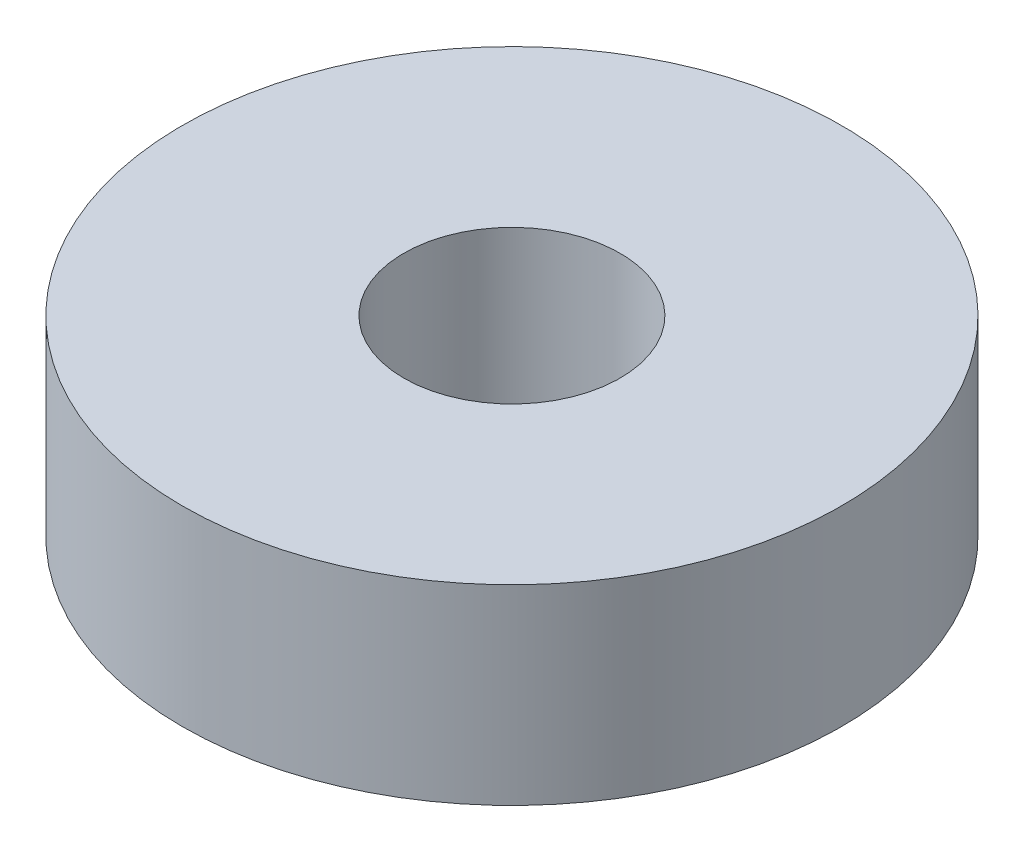
ISO-10303-21;
HEADER;
FILE_DESCRIPTION(('STEP AP214'),'2;1');
FILE_NAME('part.step','',(''),(''),'','','');
FILE_SCHEMA(('AUTOMOTIVE_DESIGN { 1 0 10303 214 1 1 1 1 }'));
ENDSEC;
DATA;
#1=APPLICATION_CONTEXT('core data for automotive mechanical design processes');
#2=APPLICATION_PROTOCOL_DEFINITION('international standard','automotive_design',2000,#1);
#3=PRODUCT_CONTEXT('',#1,'mechanical');
#4=PRODUCT('Part','Part','',(#3));
#5=PRODUCT_RELATED_PRODUCT_CATEGORY('part','',(#4));
#6=PRODUCT_DEFINITION_FORMATION('','',#4);
#7=PRODUCT_DEFINITION_CONTEXT('part definition',#1,'design');
#8=PRODUCT_DEFINITION('design','',#6,#7);
#9=PRODUCT_DEFINITION_SHAPE('','',#8);
#10=(LENGTH_UNIT() NAMED_UNIT(*) SI_UNIT(.MILLI.,.METRE.));
#11=(NAMED_UNIT(*) PLANE_ANGLE_UNIT() SI_UNIT($,.RADIAN.));
#12=(NAMED_UNIT(*) SI_UNIT($,.STERADIAN.) SOLID_ANGLE_UNIT());
#13=UNCERTAINTY_MEASURE_WITH_UNIT(LENGTH_MEASURE(1.E-05),#10,'distance_accuracy_value','');
#14=(GEOMETRIC_REPRESENTATION_CONTEXT(3) GLOBAL_UNCERTAINTY_ASSIGNED_CONTEXT((#13)) GLOBAL_UNIT_ASSIGNED_CONTEXT((#10,
#11,#12)) REPRESENTATION_CONTEXT('',''));
#15=CARTESIAN_POINT('',(0.,0.,0.));
#16=DIRECTION('',(0.,0.,1.));
#17=DIRECTION('',(1.,0.,0.));
#18=AXIS2_PLACEMENT_3D('',#15,#16,#17);
#19=CARTESIAN_POINT('',(0.,8.7,0.));
#20=DIRECTION('',(0.,1.,0.));
#21=DIRECTION('',(0.,0.,1.));
#22=AXIS2_PLACEMENT_3D('',#19,#20,#21);
#23=PLANE('',#22);
#24=CARTESIAN_POINT('',(0.,8.7,0.));
#25=DIRECTION('',(0.,1.,0.));
#26=DIRECTION('',(0.,0.,1.));
#27=AXIS2_PLACEMENT_3D('',#24,#25,#26);
#28=CIRCLE('',#27,15.);
#29=CARTESIAN_POINT('',(0.,8.7,15.));
#30=VERTEX_POINT('',#29);
#31=EDGE_CURVE('E10',#30,#30,#28,.T.);
#32=ORIENTED_EDGE('',*,*,#31,.T.);
#33=EDGE_LOOP('',(#32));
#34=FACE_BOUND('',#33,.T.);
#35=CARTESIAN_POINT('',(0.,8.7,0.));
#36=DIRECTION('',(0.,1.,0.));
#37=DIRECTION('',(0.,0.,1.));
#38=AXIS2_PLACEMENT_3D('',#35,#36,#37);
#39=CIRCLE('',#38,4.925);
#40=CARTESIAN_POINT('',(0.,8.7,4.925));
#41=VERTEX_POINT('',#40);
#42=EDGE_CURVE('E48',#41,#41,#39,.T.);
#43=ORIENTED_EDGE('',*,*,#42,.F.);
#44=EDGE_LOOP('',(#43));
#45=FACE_BOUND('',#44,.T.);
#46=ADVANCED_FACE('F37',(#34,#45),#23,.T.);
#47=CARTESIAN_POINT('',(0.,0.,0.));
#48=DIRECTION('',(0.,1.,0.));
#49=DIRECTION('',(0.,0.,1.));
#50=AXIS2_PLACEMENT_3D('',#47,#48,#49);
#51=PLANE('',#50);
#52=CARTESIAN_POINT('',(0.,0.,0.));
#53=DIRECTION('',(0.,1.,0.));
#54=DIRECTION('',(0.,0.,1.));
#55=AXIS2_PLACEMENT_3D('',#52,#53,#54);
#56=CIRCLE('',#55,15.);
#57=CARTESIAN_POINT('',(0.,0.,15.));
#58=VERTEX_POINT('',#57);
#59=EDGE_CURVE('E41',#58,#58,#56,.T.);
#60=ORIENTED_EDGE('',*,*,#59,.F.);
#61=EDGE_LOOP('',(#60));
#62=FACE_BOUND('',#61,.T.);
#63=CARTESIAN_POINT('',(0.,0.,0.));
#64=DIRECTION('',(0.,1.,0.));
#65=DIRECTION('',(0.,0.,1.));
#66=AXIS2_PLACEMENT_3D('',#63,#64,#65);
#67=CIRCLE('',#66,4.925);
#68=CARTESIAN_POINT('',(0.,0.,4.925));
#69=VERTEX_POINT('',#68);
#70=EDGE_CURVE('E50',#69,#69,#67,.T.);
#71=ORIENTED_EDGE('',*,*,#70,.T.);
#72=EDGE_LOOP('',(#71));
#73=FACE_BOUND('',#72,.T.);
#74=ADVANCED_FACE('F60',(#62,#73),#51,.F.);
#75=CARTESIAN_POINT('',(0.,8.7,0.));
#76=DIRECTION('',(0.,-1.,0.));
#77=DIRECTION('',(0.,0.,-1.));
#78=AXIS2_PLACEMENT_3D('',#75,#76,#77);
#79=CYLINDRICAL_SURFACE('',#78,15.);
#80=ORIENTED_EDGE('',*,*,#31,.F.);
#81=EDGE_LOOP('',(#80));
#82=FACE_BOUND('',#81,.T.);
#83=ORIENTED_EDGE('',*,*,#59,.T.);
#84=EDGE_LOOP('',(#83));
#85=FACE_BOUND('',#84,.T.);
#86=ADVANCED_FACE('F39',(#82,#85),#79,.T.);
#87=CARTESIAN_POINT('',(0.,8.7,0.));
#88=DIRECTION('',(0.,-1.,0.));
#89=DIRECTION('',(0.,0.,-1.));
#90=AXIS2_PLACEMENT_3D('',#87,#88,#89);
#91=CYLINDRICAL_SURFACE('',#90,4.925);
#92=ORIENTED_EDGE('',*,*,#42,.T.);
#93=EDGE_LOOP('',(#92));
#94=FACE_BOUND('',#93,.T.);
#95=ORIENTED_EDGE('',*,*,#70,.F.);
#96=EDGE_LOOP('',(#95));
#97=FACE_BOUND('',#96,.T.);
#98=ADVANCED_FACE('F56',(#94,#97),#91,.F.);
#99=CLOSED_SHELL('',(#46,#74,#86,#98));
#100=MANIFOLD_SOLID_BREP('B2',#99);
#101=ADVANCED_BREP_SHAPE_REPRESENTATION('',(#18,#100),#14);
#102=SHAPE_DEFINITION_REPRESENTATION(#9,#101);
ENDSEC;
END-ISO-10303-21;
